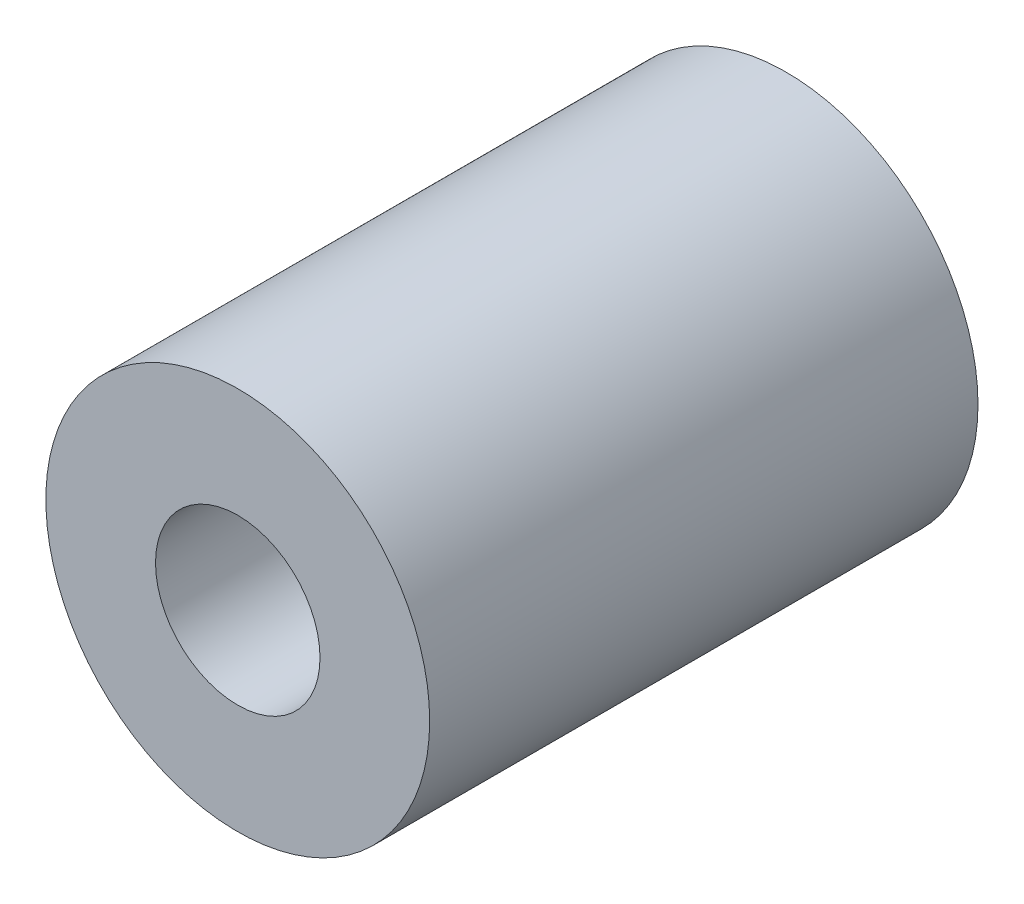
ISO-10303-21;
HEADER;
FILE_DESCRIPTION(('STEP AP214'),'2;1');
FILE_NAME('part.step','',(''),(''),'','','');
FILE_SCHEMA(('AUTOMOTIVE_DESIGN { 1 0 10303 214 1 1 1 1 }'));
ENDSEC;
DATA;
#1=APPLICATION_CONTEXT('core data for automotive mechanical design processes');
#2=APPLICATION_PROTOCOL_DEFINITION('international standard','automotive_design',2000,#1);
#3=PRODUCT_CONTEXT('',#1,'mechanical');
#4=PRODUCT('Part','Part','',(#3));
#5=PRODUCT_RELATED_PRODUCT_CATEGORY('part','',(#4));
#6=PRODUCT_DEFINITION_FORMATION('','',#4);
#7=PRODUCT_DEFINITION_CONTEXT('part definition',#1,'design');
#8=PRODUCT_DEFINITION('design','',#6,#7);
#9=PRODUCT_DEFINITION_SHAPE('','',#8);
#10=(LENGTH_UNIT() NAMED_UNIT(*) SI_UNIT(.MILLI.,.METRE.));
#11=(NAMED_UNIT(*) PLANE_ANGLE_UNIT() SI_UNIT($,.RADIAN.));
#12=(NAMED_UNIT(*) SI_UNIT($,.STERADIAN.) SOLID_ANGLE_UNIT());
#13=UNCERTAINTY_MEASURE_WITH_UNIT(LENGTH_MEASURE(1.E-05),#10,'distance_accuracy_value','');
#14=(GEOMETRIC_REPRESENTATION_CONTEXT(3) GLOBAL_UNCERTAINTY_ASSIGNED_CONTEXT((#13)) GLOBAL_UNIT_ASSIGNED_CONTEXT((#10,
#11,#12)) REPRESENTATION_CONTEXT('',''));
#15=CARTESIAN_POINT('',(0.,0.,0.));
#16=DIRECTION('',(0.,0.,1.));
#17=DIRECTION('',(1.,0.,0.));
#18=AXIS2_PLACEMENT_3D('',#15,#16,#17);
#19=CARTESIAN_POINT('',(-0.677853787764138,1.33810098363831,10.));
#20=DIRECTION('',(0.,0.,1.));
#21=DIRECTION('',(1.,0.,0.));
#22=AXIS2_PLACEMENT_3D('',#19,#20,#21);
#23=PLANE('',#22);
#24=CARTESIAN_POINT('',(-0.677853787764138,1.33810098363831,10.));
#25=DIRECTION('',(0.,0.,1.));
#26=DIRECTION('',(1.,0.,0.));
#27=AXIS2_PLACEMENT_3D('',#24,#25,#26);
#28=CIRCLE('',#27,3.5);
#29=CARTESIAN_POINT('',(2.82214621223586,1.33810098363831,10.));
#30=VERTEX_POINT('',#29);
#31=EDGE_CURVE('E10',#30,#30,#28,.T.);
#32=ORIENTED_EDGE('',*,*,#31,.T.);
#33=EDGE_LOOP('',(#32));
#34=FACE_BOUND('',#33,.T.);
#35=CARTESIAN_POINT('',(-0.677853787764138,1.33810098363831,10.));
#36=DIRECTION('',(0.,0.,1.));
#37=DIRECTION('',(1.,0.,0.));
#38=AXIS2_PLACEMENT_3D('',#35,#36,#37);
#39=CIRCLE('',#38,1.5);
#40=CARTESIAN_POINT('',(0.822146212235862,1.33810098363831,10.));
#41=VERTEX_POINT('',#40);
#42=EDGE_CURVE('E42',#41,#41,#39,.T.);
#43=ORIENTED_EDGE('',*,*,#42,.F.);
#44=EDGE_LOOP('',(#43));
#45=FACE_BOUND('',#44,.T.);
#46=ADVANCED_FACE('F31',(#34,#45),#23,.T.);
#47=CARTESIAN_POINT('',(-0.677853787764138,1.33810098363831,0.));
#48=DIRECTION('',(0.,0.,1.));
#49=DIRECTION('',(1.,0.,0.));
#50=AXIS2_PLACEMENT_3D('',#47,#48,#49);
#51=PLANE('',#50);
#52=CARTESIAN_POINT('',(-0.677853787764138,1.33810098363831,0.));
#53=DIRECTION('',(0.,0.,1.));
#54=DIRECTION('',(1.,0.,0.));
#55=AXIS2_PLACEMENT_3D('',#52,#53,#54);
#56=CIRCLE('',#55,3.5);
#57=CARTESIAN_POINT('',(2.82214621223586,1.33810098363831,0.));
#58=VERTEX_POINT('',#57);
#59=EDGE_CURVE('E35',#58,#58,#56,.T.);
#60=ORIENTED_EDGE('',*,*,#59,.F.);
#61=EDGE_LOOP('',(#60));
#62=FACE_BOUND('',#61,.T.);
#63=CARTESIAN_POINT('',(-0.677853787764138,1.33810098363831,0.));
#64=DIRECTION('',(0.,0.,1.));
#65=DIRECTION('',(1.,0.,0.));
#66=AXIS2_PLACEMENT_3D('',#63,#64,#65);
#67=CIRCLE('',#66,1.5);
#68=CARTESIAN_POINT('',(0.822146212235862,1.33810098363831,0.));
#69=VERTEX_POINT('',#68);
#70=EDGE_CURVE('E44',#69,#69,#67,.T.);
#71=ORIENTED_EDGE('',*,*,#70,.T.);
#72=EDGE_LOOP('',(#71));
#73=FACE_BOUND('',#72,.T.);
#74=ADVANCED_FACE('F54',(#62,#73),#51,.F.);
#75=CARTESIAN_POINT('',(-0.677853787764138,1.33810098363831,10.));
#76=DIRECTION('',(0.,0.,-1.));
#77=DIRECTION('',(-1.,0.,0.));
#78=AXIS2_PLACEMENT_3D('',#75,#76,#77);
#79=CYLINDRICAL_SURFACE('',#78,3.5);
#80=ORIENTED_EDGE('',*,*,#31,.F.);
#81=EDGE_LOOP('',(#80));
#82=FACE_BOUND('',#81,.T.);
#83=ORIENTED_EDGE('',*,*,#59,.T.);
#84=EDGE_LOOP('',(#83));
#85=FACE_BOUND('',#84,.T.);
#86=ADVANCED_FACE('F33',(#82,#85),#79,.T.);
#87=CARTESIAN_POINT('',(-0.677853787764138,1.33810098363831,10.));
#88=DIRECTION('',(0.,0.,-1.));
#89=DIRECTION('',(-1.,0.,0.));
#90=AXIS2_PLACEMENT_3D('',#87,#88,#89);
#91=CYLINDRICAL_SURFACE('',#90,1.5);
#92=ORIENTED_EDGE('',*,*,#42,.T.);
#93=EDGE_LOOP('',(#92));
#94=FACE_BOUND('',#93,.T.);
#95=ORIENTED_EDGE('',*,*,#70,.F.);
#96=EDGE_LOOP('',(#95));
#97=FACE_BOUND('',#96,.T.);
#98=ADVANCED_FACE('F50',(#94,#97),#91,.F.);
#99=CLOSED_SHELL('',(#46,#74,#86,#98));
#100=MANIFOLD_SOLID_BREP('B2',#99);
#101=ADVANCED_BREP_SHAPE_REPRESENTATION('',(#18,#100),#14);
#102=SHAPE_DEFINITION_REPRESENTATION(#9,#101);
ENDSEC;
END-ISO-10303-21;
